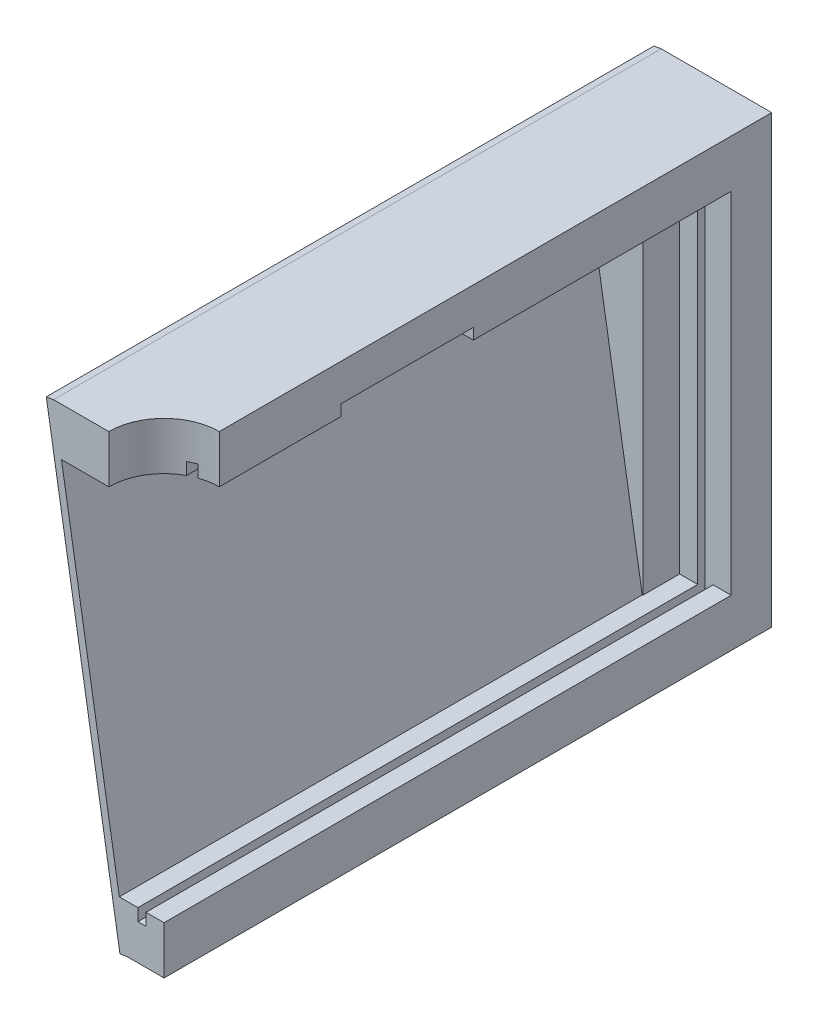
ISO-10303-21;
HEADER;
FILE_DESCRIPTION(('STEP AP214'),'2;1');
FILE_NAME('part.step','',(''),(''),'','','');
FILE_SCHEMA(('AUTOMOTIVE_DESIGN { 1 0 10303 214 1 1 1 1 }'));
ENDSEC;
DATA;
#1=APPLICATION_CONTEXT('core data for automotive mechanical design processes');
#2=APPLICATION_PROTOCOL_DEFINITION('international standard','automotive_design',2000,#1);
#3=PRODUCT_CONTEXT('',#1,'mechanical');
#4=PRODUCT('Part','Part','',(#3));
#5=PRODUCT_RELATED_PRODUCT_CATEGORY('part','',(#4));
#6=PRODUCT_DEFINITION_FORMATION('','',#4);
#7=PRODUCT_DEFINITION_CONTEXT('part definition',#1,'design');
#8=PRODUCT_DEFINITION('design','',#6,#7);
#9=PRODUCT_DEFINITION_SHAPE('','',#8);
#10=(LENGTH_UNIT() NAMED_UNIT(*) SI_UNIT(.MILLI.,.METRE.));
#11=(NAMED_UNIT(*) PLANE_ANGLE_UNIT() SI_UNIT($,.RADIAN.));
#12=(NAMED_UNIT(*) SI_UNIT($,.STERADIAN.) SOLID_ANGLE_UNIT());
#13=UNCERTAINTY_MEASURE_WITH_UNIT(LENGTH_MEASURE(1.E-05),#10,'distance_accuracy_value','');
#14=(GEOMETRIC_REPRESENTATION_CONTEXT(3) GLOBAL_UNCERTAINTY_ASSIGNED_CONTEXT((#13)) GLOBAL_UNIT_ASSIGNED_CONTEXT((#10,
#11,#12)) REPRESENTATION_CONTEXT('',''));
#15=CARTESIAN_POINT('',(0.,0.,0.));
#16=DIRECTION('',(0.,0.,1.));
#17=DIRECTION('',(1.,0.,0.));
#18=AXIS2_PLACEMENT_3D('',#15,#16,#17);
#19=CARTESIAN_POINT('',(40.,104.12857495044,-107.873574899705));
#20=DIRECTION('',(0.,1.,0.));
#21=DIRECTION('',(0.,0.,1.));
#22=AXIS2_PLACEMENT_3D('',#19,#20,#21);
#23=PLANE('',#22);
#24=CARTESIAN_POINT('',(40.,104.12857495044,34.1264251002952));
#25=DIRECTION('',(0.,1.,0.));
#26=DIRECTION('',(0.,0.,1.));
#27=AXIS2_PLACEMENT_3D('',#24,#25,#26);
#28=CIRCLE('',#27,15.);
#29=CARTESIAN_POINT('',(40.,104.12857495044,19.1264251002952));
#30=VERTEX_POINT('',#29);
#31=CARTESIAN_POINT('',(35.1,104.12857495044,19.9493308987318));
#32=VERTEX_POINT('',#31);
#33=EDGE_CURVE('E283',#30,#32,#28,.T.);
#34=ORIENTED_EDGE('',*,*,#33,.T.);
#35=DIRECTION('',(0.,0.,-1.));
#36=VECTOR('',#35,1.);
#37=CARTESIAN_POINT('',(35.1,104.12857495044,-107.873574899705));
#38=LINE('',#37,#36);
#39=CARTESIAN_POINT('',(35.1,104.12857495044,-13.8735748997049));
#40=VERTEX_POINT('',#39);
#41=EDGE_CURVE('E48',#32,#40,#38,.T.);
#42=ORIENTED_EDGE('',*,*,#41,.T.);
#43=DIRECTION('',(1.,0.,0.));
#44=VECTOR('',#43,1.);
#45=CARTESIAN_POINT('',(34.,104.12857495044,-13.8735748997049));
#46=LINE('',#45,#44);
#47=CARTESIAN_POINT('',(40.,104.12857495044,-13.8735748997049));
#48=VERTEX_POINT('',#47);
#49=EDGE_CURVE('E296',#40,#48,#46,.T.);
#50=ORIENTED_EDGE('',*,*,#49,.T.);
#51=DIRECTION('',(0.,0.,-1.));
#52=VECTOR('',#51,1.);
#53=CARTESIAN_POINT('',(40.,104.12857495044,-107.873574899705));
#54=LINE('',#53,#52);
#55=EDGE_CURVE('E364',#30,#48,#54,.T.);
#56=ORIENTED_EDGE('',*,*,#55,.F.);
#57=EDGE_LOOP('',(#34,#42,#50,#56));
#58=FACE_BOUND('',#57,.T.);
#59=ADVANCED_FACE('F33',(#58),#23,.F.);
#60=CARTESIAN_POINT('',(40.,104.12857495044,-107.873574899705));
#61=DIRECTION('',(0.,0.,-1.));
#62=DIRECTION('',(0.,1.,0.));
#63=AXIS2_PLACEMENT_3D('',#60,#61,#62);
#64=PLANE('',#63);
#65=DIRECTION('',(0.,-1.,0.));
#66=VECTOR('',#65,1.);
#67=CARTESIAN_POINT('',(28.,104.12857495044,-107.873574899705));
#68=LINE('',#67,#66);
#69=CARTESIAN_POINT('',(28.,104.12857495044,-107.873574899705));
#70=VERTEX_POINT('',#69);
#71=CARTESIAN_POINT('',(28.,9.1285749504402,-107.873574899705));
#72=VERTEX_POINT('',#71);
#73=EDGE_CURVE('E298',#70,#72,#68,.T.);
#74=ORIENTED_EDGE('',*,*,#73,.F.);
#75=DIRECTION('',(-1.,0.,0.));
#76=VECTOR('',#75,1.);
#77=CARTESIAN_POINT('',(40.,104.12857495044,-107.873574899705));
#78=LINE('',#77,#76);
#79=CARTESIAN_POINT('',(12.1487603305785,104.12857495044,-107.873574899705));
#80=VERTEX_POINT('',#79);
#81=EDGE_CURVE('E384',#70,#80,#78,.T.);
#82=ORIENTED_EDGE('',*,*,#81,.T.);
#83=DIRECTION('',(0.163076596924055,-0.986613411390535,0.));
#84=VECTOR('',#83,1.);
#85=CARTESIAN_POINT('',(12.8894355428495,99.6474899162005,-107.873574899705));
#86=LINE('',#85,#84);
#87=CARTESIAN_POINT('',(27.8512396694215,9.1285749504402,-107.873574899705));
#88=VERTEX_POINT('',#87);
#89=EDGE_CURVE('E352',#80,#88,#86,.T.);
#90=ORIENTED_EDGE('',*,*,#89,.T.);
#91=DIRECTION('',(-1.,0.,0.));
#92=VECTOR('',#91,1.);
#93=CARTESIAN_POINT('',(40.,9.1285749504402,-107.873574899705));
#94=LINE('',#93,#92);
#95=EDGE_CURVE('E382',#72,#88,#94,.T.);
#96=ORIENTED_EDGE('',*,*,#95,.F.);
#97=EDGE_LOOP('',(#74,#82,#90,#96));
#98=FACE_BOUND('',#97,.T.);
#99=ADVANCED_FACE('F466',(#98),#64,.F.);
#100=CARTESIAN_POINT('',(40.,9.1285749504402,-107.873574899705));
#101=DIRECTION('',(0.,-1.,0.));
#102=DIRECTION('',(0.,0.,-1.));
#103=AXIS2_PLACEMENT_3D('',#100,#101,#102);
#104=PLANE('',#103);
#105=DIRECTION('',(-1.,0.,0.));
#106=VECTOR('',#105,1.);
#107=CARTESIAN_POINT('',(40.,9.12857495044018,34.1264251002951));
#108=LINE('',#107,#106);
#109=CARTESIAN_POINT('',(32.9,9.12857495044021,34.1264251002951));
#110=VERTEX_POINT('',#109);
#111=CARTESIAN_POINT('',(27.8512396694215,9.12857495044018,34.1264251002952));
#112=VERTEX_POINT('',#111);
#113=EDGE_CURVE('E378',#110,#112,#108,.T.);
#114=ORIENTED_EDGE('',*,*,#113,.F.);
#115=DIRECTION('',(0.,0.,-1.));
#116=VECTOR('',#115,1.);
#117=CARTESIAN_POINT('',(32.9,9.1285749504402,-107.873574899705));
#118=LINE('',#117,#116);
#119=CARTESIAN_POINT('',(32.9,9.1285749504402,-117.873574899705));
#120=VERTEX_POINT('',#119);
#121=EDGE_CURVE('E264',#110,#120,#118,.T.);
#122=ORIENTED_EDGE('',*,*,#121,.T.);
#123=DIRECTION('',(1.,0.,0.));
#124=VECTOR('',#123,1.);
#125=CARTESIAN_POINT('',(28.,9.1285749504402,-117.873574899705));
#126=LINE('',#125,#124);
#127=CARTESIAN_POINT('',(28.,9.1285749504402,-117.873574899705));
#128=VERTEX_POINT('',#127);
#129=EDGE_CURVE('E314',#128,#120,#126,.T.);
#130=ORIENTED_EDGE('',*,*,#129,.F.);
#131=DIRECTION('',(0.,0.,-1.));
#132=VECTOR('',#131,1.);
#133=CARTESIAN_POINT('',(28.,9.1285749504402,-107.873574899705));
#134=LINE('',#133,#132);
#135=EDGE_CURVE('E306',#72,#128,#134,.T.);
#136=ORIENTED_EDGE('',*,*,#135,.F.);
#137=ORIENTED_EDGE('',*,*,#95,.T.);
#138=DIRECTION('',(0.,0.,1.));
#139=VECTOR('',#138,1.);
#140=CARTESIAN_POINT('',(27.8512396694215,9.1285749504402,-107.873574899705));
#141=LINE('',#140,#139);
#142=EDGE_CURVE('E347',#88,#112,#141,.T.);
#143=ORIENTED_EDGE('',*,*,#142,.T.);
#144=EDGE_LOOP('',(#114,#122,#130,#136,#137,#143));
#145=FACE_BOUND('',#144,.T.);
#146=ADVANCED_FACE('F471',(#145),#104,.F.);
#147=DIRECTION('',(1.,0.,0.));
#148=VECTOR('',#147,1.);
#149=CARTESIAN_POINT('',(28.,104.12857495044,-117.873574899705));
#150=LINE('',#149,#148);
#151=CARTESIAN_POINT('',(28.,104.12857495044,-117.873574899705));
#152=VERTEX_POINT('',#151);
#153=CARTESIAN_POINT('',(32.9,104.12857495044,-117.873574899705));
#154=VERTEX_POINT('',#153);
#155=EDGE_CURVE('E215',#152,#154,#150,.T.);
#156=ORIENTED_EDGE('',*,*,#155,.T.);
#157=DIRECTION('',(0.,0.,1.));
#158=VECTOR('',#157,1.);
#159=CARTESIAN_POINT('',(32.9,104.12857495044,-107.873574899705));
#160=LINE('',#159,#158);
#161=CARTESIAN_POINT('',(32.9,104.12857495044,20.9131741755605));
#162=VERTEX_POINT('',#161);
#163=EDGE_CURVE('E258',#154,#162,#160,.T.);
#164=ORIENTED_EDGE('',*,*,#163,.T.);
#165=CARTESIAN_POINT('',(40.,104.12857495044,34.1264251002952));
#166=DIRECTION('',(0.,1.,0.));
#167=DIRECTION('',(0.,0.,1.));
#168=AXIS2_PLACEMENT_3D('',#165,#166,#167);
#169=CIRCLE('',#168,15.);
#170=CARTESIAN_POINT('',(25.,104.12857495044,34.1264251002952));
#171=VERTEX_POINT('',#170);
#172=EDGE_CURVE('E280',#162,#171,#169,.T.);
#173=ORIENTED_EDGE('',*,*,#172,.T.);
#174=DIRECTION('',(-1.,0.,0.));
#175=VECTOR('',#174,1.);
#176=CARTESIAN_POINT('',(40.,104.12857495044,34.1264251002952));
#177=LINE('',#176,#175);
#178=CARTESIAN_POINT('',(12.1487603305785,104.12857495044,34.1264251002952));
#179=VERTEX_POINT('',#178);
#180=EDGE_CURVE('E386',#171,#179,#177,.T.);
#181=ORIENTED_EDGE('',*,*,#180,.T.);
#182=DIRECTION('',(0.,0.,-1.));
#183=VECTOR('',#182,1.);
#184=CARTESIAN_POINT('',(12.1487603305785,104.12857495044,-107.873574899705));
#185=LINE('',#184,#183);
#186=EDGE_CURVE('E355',#179,#80,#185,.T.);
#187=ORIENTED_EDGE('',*,*,#186,.T.);
#188=ORIENTED_EDGE('',*,*,#81,.F.);
#189=DIRECTION('',(0.,0.,1.));
#190=VECTOR('',#189,1.);
#191=CARTESIAN_POINT('',(28.,104.12857495044,-107.873574899705));
#192=LINE('',#191,#190);
#193=EDGE_CURVE('E312',#152,#70,#192,.T.);
#194=ORIENTED_EDGE('',*,*,#193,.F.);
#195=EDGE_LOOP('',(#156,#164,#173,#181,#187,#188,#194));
#196=FACE_BOUND('',#195,.T.);
#197=ADVANCED_FACE('F447',(#196),#23,.F.);
#198=CARTESIAN_POINT('',(40.,117.12857495044,-130.873574899705));
#199=DIRECTION('',(0.,0.,1.));
#200=DIRECTION('',(1.,0.,0.));
#201=AXIS2_PLACEMENT_3D('',#198,#199,#200);
#202=PLANE('',#201);
#203=DIRECTION('',(-1.,0.,0.));
#204=VECTOR('',#203,1.);
#205=CARTESIAN_POINT('',(40.,-3.8714250495598,-130.873574899705));
#206=LINE('',#205,#204);
#207=CARTESIAN_POINT('',(40.,-3.8714250495598,-130.873574899705));
#208=VERTEX_POINT('',#207);
#209=CARTESIAN_POINT('',(30.,-3.8714250495598,-130.873574899705));
#210=VERTEX_POINT('',#209);
#211=EDGE_CURVE('E372',#208,#210,#206,.T.);
#212=ORIENTED_EDGE('',*,*,#211,.T.);
#213=DIRECTION('',(0.986613411390535,0.163076596924055,0.));
#214=VECTOR('',#213,1.);
#215=CARTESIAN_POINT('',(28.0267731772189,-4.19757824340791,-130.873574899705));
#216=LINE('',#215,#214);
#217=CARTESIAN_POINT('',(28.0267731772189,-4.19757824340791,-130.873574899705));
#218=VERTEX_POINT('',#217);
#219=EDGE_CURVE('E339',#218,#210,#216,.T.);
#220=ORIENTED_EDGE('',*,*,#219,.F.);
#221=DIRECTION('',(0.163076596924055,-0.986613411390535,0.));
#222=VECTOR('',#221,1.);
#223=CARTESIAN_POINT('',(8.02677317721893,116.802421756592,-130.873574899705));
#224=LINE('',#223,#222);
#225=CARTESIAN_POINT('',(8.02677317721893,116.802421756592,-130.873574899705));
#226=VERTEX_POINT('',#225);
#227=EDGE_CURVE('E325',#226,#218,#224,.T.);
#228=ORIENTED_EDGE('',*,*,#227,.F.);
#229=DIRECTION('',(0.986613411390535,0.163076596924055,0.));
#230=VECTOR('',#229,1.);
#231=CARTESIAN_POINT('',(8.02677317721893,116.802421756592,-130.873574899705));
#232=LINE('',#231,#230);
#233=CARTESIAN_POINT('',(10.,117.12857495044,-130.873574899705));
#234=VERTEX_POINT('',#233);
#235=EDGE_CURVE('E341',#226,#234,#232,.T.);
#236=ORIENTED_EDGE('',*,*,#235,.T.);
#237=DIRECTION('',(-1.,0.,0.));
#238=VECTOR('',#237,1.);
#239=CARTESIAN_POINT('',(40.,117.12857495044,-130.873574899705));
#240=LINE('',#239,#238);
#241=CARTESIAN_POINT('',(40.,117.12857495044,-130.873574899705));
#242=VERTEX_POINT('',#241);
#243=EDGE_CURVE('E390',#242,#234,#240,.T.);
#244=ORIENTED_EDGE('',*,*,#243,.F.);
#245=DIRECTION('',(0.,1.,0.));
#246=VECTOR('',#245,1.);
#247=CARTESIAN_POINT('',(40.,117.12857495044,-130.873574899705));
#248=LINE('',#247,#246);
#249=EDGE_CURVE('E358',#208,#242,#248,.T.);
#250=ORIENTED_EDGE('',*,*,#249,.F.);
#251=EDGE_LOOP('',(#212,#220,#228,#236,#244,#250));
#252=FACE_BOUND('',#251,.T.);
#253=ADVANCED_FACE('F35',(#252),#202,.F.);
#254=CARTESIAN_POINT('',(40.,117.12857495044,-130.873574899705));
#255=DIRECTION('',(0.,-1.,0.));
#256=DIRECTION('',(0.,0.,-1.));
#257=AXIS2_PLACEMENT_3D('',#254,#255,#256);
#258=PLANE('',#257);
#259=DIRECTION('',(-1.,0.,0.));
#260=VECTOR('',#259,1.);
#261=CARTESIAN_POINT('',(40.,117.12857495044,34.1264251002952));
#262=LINE('',#261,#260);
#263=CARTESIAN_POINT('',(25.,117.12857495044,34.1264251002952));
#264=VERTEX_POINT('',#263);
#265=CARTESIAN_POINT('',(10.,117.12857495044,34.1264251002952));
#266=VERTEX_POINT('',#265);
#267=EDGE_CURVE('E388',#264,#266,#262,.T.);
#268=ORIENTED_EDGE('',*,*,#267,.F.);
#269=CARTESIAN_POINT('',(40.,117.12857495044,34.1264251002952));
#270=DIRECTION('',(0.,1.,0.));
#271=DIRECTION('',(0.,0.,1.));
#272=AXIS2_PLACEMENT_3D('',#269,#270,#271);
#273=CIRCLE('',#272,15.);
#274=CARTESIAN_POINT('',(40.,117.12857495044,19.1264251002952));
#275=VERTEX_POINT('',#274);
#276=EDGE_CURVE('E273',#275,#264,#273,.T.);
#277=ORIENTED_EDGE('',*,*,#276,.F.);
#278=DIRECTION('',(0.,0.,1.));
#279=VECTOR('',#278,1.);
#280=CARTESIAN_POINT('',(40.,117.12857495044,-130.873574899705));
#281=LINE('',#280,#279);
#282=EDGE_CURVE('E360',#242,#275,#281,.T.);
#283=ORIENTED_EDGE('',*,*,#282,.F.);
#284=ORIENTED_EDGE('',*,*,#243,.T.);
#285=DIRECTION('',(0.,0.,-1.));
#286=VECTOR('',#285,1.);
#287=CARTESIAN_POINT('',(10.,117.12857495044,97.1264251002952));
#288=LINE('',#287,#286);
#289=EDGE_CURVE('E343',#266,#234,#288,.T.);
#290=ORIENTED_EDGE('',*,*,#289,.F.);
#291=EDGE_LOOP('',(#268,#277,#283,#284,#290));
#292=FACE_BOUND('',#291,.T.);
#293=ADVANCED_FACE('F439',(#292),#258,.F.);
#294=DIRECTION('',(1.,0.,0.));
#295=VECTOR('',#294,1.);
#296=CARTESIAN_POINT('',(34.,104.12857495044,-49.8735748997048));
#297=LINE('',#296,#295);
#298=CARTESIAN_POINT('',(35.1,104.12857495044,-49.8735748997048));
#299=VERTEX_POINT('',#298);
#300=CARTESIAN_POINT('',(40.,104.12857495044,-49.8735748997048));
#301=VERTEX_POINT('',#300);
#302=EDGE_CURVE('E295',#299,#301,#297,.T.);
#303=ORIENTED_EDGE('',*,*,#302,.F.);
#304=DIRECTION('',(0.,0.,-1.));
#305=VECTOR('',#304,1.);
#306=CARTESIAN_POINT('',(35.1,104.12857495044,-107.873574899705));
#307=LINE('',#306,#305);
#308=CARTESIAN_POINT('',(35.1,104.12857495044,-119.873574899705));
#309=VERTEX_POINT('',#308);
#310=EDGE_CURVE('E254',#299,#309,#307,.T.);
#311=ORIENTED_EDGE('',*,*,#310,.T.);
#312=DIRECTION('',(1.,0.,0.));
#313=VECTOR('',#312,1.);
#314=CARTESIAN_POINT('',(35.,104.12857495044,-119.873574899705));
#315=LINE('',#314,#313);
#316=CARTESIAN_POINT('',(40.,104.12857495044,-119.873574899705));
#317=VERTEX_POINT('',#316);
#318=EDGE_CURVE('E271',#309,#317,#315,.T.);
#319=ORIENTED_EDGE('',*,*,#318,.T.);
#320=EDGE_CURVE('E363',#301,#317,#54,.T.);
#321=ORIENTED_EDGE('',*,*,#320,.F.);
#322=EDGE_LOOP('',(#303,#311,#319,#321));
#323=FACE_BOUND('',#322,.T.);
#324=ADVANCED_FACE('F418',(#323),#23,.F.);
#325=DIRECTION('',(1.,0.,0.));
#326=VECTOR('',#325,1.);
#327=CARTESIAN_POINT('',(35.,9.1285749504402,-119.873574899705));
#328=LINE('',#327,#326);
#329=CARTESIAN_POINT('',(35.1,9.1285749504402,-119.873574899705));
#330=VERTEX_POINT('',#329);
#331=CARTESIAN_POINT('',(40.,9.1285749504402,-119.873574899705));
#332=VERTEX_POINT('',#331);
#333=EDGE_CURVE('E270',#330,#332,#328,.T.);
#334=ORIENTED_EDGE('',*,*,#333,.F.);
#335=DIRECTION('',(0.,0.,1.));
#336=VECTOR('',#335,1.);
#337=CARTESIAN_POINT('',(35.1,9.1285749504402,-107.873574899705));
#338=LINE('',#337,#336);
#339=CARTESIAN_POINT('',(35.1,9.12857495044018,34.1264251002951));
#340=VERTEX_POINT('',#339);
#341=EDGE_CURVE('E227',#330,#340,#338,.T.);
#342=ORIENTED_EDGE('',*,*,#341,.T.);
#343=CARTESIAN_POINT('',(40.,9.12857495044018,34.1264251002951));
#344=VERTEX_POINT('',#343);
#345=EDGE_CURVE('E379',#344,#340,#108,.T.);
#346=ORIENTED_EDGE('',*,*,#345,.F.);
#347=DIRECTION('',(0.,0.,1.));
#348=VECTOR('',#347,1.);
#349=CARTESIAN_POINT('',(40.,9.1285749504402,-107.873574899705));
#350=LINE('',#349,#348);
#351=EDGE_CURVE('E367',#332,#344,#350,.T.);
#352=ORIENTED_EDGE('',*,*,#351,.F.);
#353=EDGE_LOOP('',(#334,#342,#346,#352));
#354=FACE_BOUND('',#353,.T.);
#355=ADVANCED_FACE('F425',(#354),#104,.F.);
#356=CARTESIAN_POINT('',(40.,9.12857495044018,34.1264251002951));
#357=DIRECTION('',(0.,0.,-1.));
#358=DIRECTION('',(0.,1.,0.));
#359=AXIS2_PLACEMENT_3D('',#356,#357,#358);
#360=PLANE('',#359);
#361=ORIENTED_EDGE('',*,*,#345,.T.);
#362=DIRECTION('',(0.,1.,0.));
#363=VECTOR('',#362,1.);
#364=CARTESIAN_POINT('',(35.1,5.82857495044018,34.1264251002951));
#365=LINE('',#364,#363);
#366=CARTESIAN_POINT('',(35.1,5.82857495044018,34.1264251002951));
#367=VERTEX_POINT('',#366);
#368=EDGE_CURVE('E233',#367,#340,#365,.T.);
#369=ORIENTED_EDGE('',*,*,#368,.F.);
#370=DIRECTION('',(1.,0.,0.));
#371=VECTOR('',#370,1.);
#372=CARTESIAN_POINT('',(35.,5.82857495044018,34.1264251002951));
#373=LINE('',#372,#371);
#374=CARTESIAN_POINT('',(32.9,5.82857495044018,34.1264251002951));
#375=VERTEX_POINT('',#374);
#376=EDGE_CURVE('E220',#375,#367,#373,.T.);
#377=ORIENTED_EDGE('',*,*,#376,.F.);
#378=DIRECTION('',(0.,-1.,0.));
#379=VECTOR('',#378,1.);
#380=CARTESIAN_POINT('',(32.9,107.42857495044,34.1264251002951));
#381=LINE('',#380,#379);
#382=EDGE_CURVE('E231',#110,#375,#381,.T.);
#383=ORIENTED_EDGE('',*,*,#382,.F.);
#384=ORIENTED_EDGE('',*,*,#113,.T.);
#385=DIRECTION('',(-0.163076596924055,0.986613411390535,0.));
#386=VECTOR('',#385,1.);
#387=CARTESIAN_POINT('',(30.,-3.8714250495598,34.1264251002952));
#388=LINE('',#387,#386);
#389=EDGE_CURVE('E321',#112,#179,#388,.T.);
#390=ORIENTED_EDGE('',*,*,#389,.T.);
#391=ORIENTED_EDGE('',*,*,#180,.F.);
#392=DIRECTION('',(0.,1.,0.));
#393=VECTOR('',#392,1.);
#394=CARTESIAN_POINT('',(25.,90.1285749504402,34.1264251002952));
#395=LINE('',#394,#393);
#396=EDGE_CURVE('E277',#171,#264,#395,.T.);
#397=ORIENTED_EDGE('',*,*,#396,.T.);
#398=ORIENTED_EDGE('',*,*,#267,.T.);
#399=DIRECTION('',(0.986613411390535,0.163076596924055,0.));
#400=VECTOR('',#399,1.);
#401=CARTESIAN_POINT('',(8.02677317721893,116.802421756592,34.1264251002952));
#402=LINE('',#401,#400);
#403=CARTESIAN_POINT('',(8.02677317721893,116.802421756592,34.1264251002952));
#404=VERTEX_POINT('',#403);
#405=EDGE_CURVE('E331',#404,#266,#402,.T.);
#406=ORIENTED_EDGE('',*,*,#405,.F.);
#407=DIRECTION('',(-0.163076596924055,0.986613411390535,0.));
#408=VECTOR('',#407,1.);
#409=CARTESIAN_POINT('',(28.0267731772189,-4.19757824340791,34.1264251002952));
#410=LINE('',#409,#408);
#411=CARTESIAN_POINT('',(28.0267731772189,-4.19757824340791,34.1264251002952));
#412=VERTEX_POINT('',#411);
#413=EDGE_CURVE('E329',#412,#404,#410,.T.);
#414=ORIENTED_EDGE('',*,*,#413,.F.);
#415=DIRECTION('',(0.986613411390535,0.163076596924055,0.));
#416=VECTOR('',#415,1.);
#417=CARTESIAN_POINT('',(28.0267731772189,-4.19757824340791,34.1264251002952));
#418=LINE('',#417,#416);
#419=CARTESIAN_POINT('',(30.,-3.8714250495598,34.1264251002952));
#420=VERTEX_POINT('',#419);
#421=EDGE_CURVE('E336',#412,#420,#418,.T.);
#422=ORIENTED_EDGE('',*,*,#421,.T.);
#423=DIRECTION('',(-1.,0.,0.));
#424=VECTOR('',#423,1.);
#425=CARTESIAN_POINT('',(40.,-3.87142504955982,34.1264251002952));
#426=LINE('',#425,#424);
#427=CARTESIAN_POINT('',(40.,-3.87142504955982,34.1264251002952));
#428=VERTEX_POINT('',#427);
#429=EDGE_CURVE('E375',#428,#420,#426,.T.);
#430=ORIENTED_EDGE('',*,*,#429,.F.);
#431=DIRECTION('',(0.,-1.,0.));
#432=VECTOR('',#431,1.);
#433=CARTESIAN_POINT('',(40.,9.12857495044018,34.1264251002951));
#434=LINE('',#433,#432);
#435=EDGE_CURVE('E369',#344,#428,#434,.T.);
#436=ORIENTED_EDGE('',*,*,#435,.F.);
#437=EDGE_LOOP('',(#361,#369,#377,#383,#384,#390,#391,#397,#398,#406,#414,#422,#430,#436));
#438=FACE_BOUND('',#437,.T.);
#439=ADVANCED_FACE('F427',(#438),#360,.F.);
#440=CARTESIAN_POINT('',(40.,-3.8714250495598,-130.873574899705));
#441=DIRECTION('',(0.,1.,0.));
#442=DIRECTION('',(0.,0.,1.));
#443=AXIS2_PLACEMENT_3D('',#440,#441,#442);
#444=PLANE('',#443);
#445=ORIENTED_EDGE('',*,*,#429,.T.);
#446=DIRECTION('',(0.,0.,-1.));
#447=VECTOR('',#446,1.);
#448=CARTESIAN_POINT('',(30.,-3.8714250495598,97.1264251002952));
#449=LINE('',#448,#447);
#450=EDGE_CURVE('E344',#420,#210,#449,.T.);
#451=ORIENTED_EDGE('',*,*,#450,.T.);
#452=ORIENTED_EDGE('',*,*,#211,.F.);
#453=DIRECTION('',(0.,0.,-1.));
#454=VECTOR('',#453,1.);
#455=CARTESIAN_POINT('',(40.,-3.8714250495598,-130.873574899705));
#456=LINE('',#455,#454);
#457=EDGE_CURVE('E56',#428,#208,#456,.T.);
#458=ORIENTED_EDGE('',*,*,#457,.F.);
#459=EDGE_LOOP('',(#445,#451,#452,#458));
#460=FACE_BOUND('',#459,.T.);
#461=ADVANCED_FACE('F431',(#460),#444,.F.);
#462=CARTESIAN_POINT('',(40.,0.,0.));
#463=DIRECTION('',(-1.,0.,0.));
#464=DIRECTION('',(0.,0.,1.));
#465=AXIS2_PLACEMENT_3D('',#462,#463,#464);
#466=PLANE('',#465);
#467=ORIENTED_EDGE('',*,*,#320,.T.);
#468=DIRECTION('',(0.,1.,0.));
#469=VECTOR('',#468,1.);
#470=CARTESIAN_POINT('',(40.,104.12857495044,-119.873574899705));
#471=LINE('',#470,#469);
#472=EDGE_CURVE('E267',#332,#317,#471,.T.);
#473=ORIENTED_EDGE('',*,*,#472,.F.);
#474=ORIENTED_EDGE('',*,*,#351,.T.);
#475=ORIENTED_EDGE('',*,*,#435,.T.);
#476=ORIENTED_EDGE('',*,*,#457,.T.);
#477=ORIENTED_EDGE('',*,*,#249,.T.);
#478=ORIENTED_EDGE('',*,*,#282,.T.);
#479=DIRECTION('',(0.,1.,0.));
#480=VECTOR('',#479,1.);
#481=CARTESIAN_POINT('',(40.,90.1285749504402,19.1264251002952));
#482=LINE('',#481,#480);
#483=EDGE_CURVE('E276',#30,#275,#482,.T.);
#484=ORIENTED_EDGE('',*,*,#483,.F.);
#485=ORIENTED_EDGE('',*,*,#55,.T.);
#486=DIRECTION('',(0.,-1.,0.));
#487=VECTOR('',#486,1.);
#488=CARTESIAN_POINT('',(40.,104.12857495044,-13.8735748997049));
#489=LINE('',#488,#487);
#490=CARTESIAN_POINT('',(40.,107.12857495044,-13.8735748997049));
#491=VERTEX_POINT('',#490);
#492=EDGE_CURVE('E292',#491,#48,#489,.T.);
#493=ORIENTED_EDGE('',*,*,#492,.F.);
#494=DIRECTION('',(0.,0.,1.));
#495=VECTOR('',#494,1.);
#496=CARTESIAN_POINT('',(40.,107.12857495044,-13.8735748997049));
#497=LINE('',#496,#495);
#498=CARTESIAN_POINT('',(40.,107.12857495044,-49.8735748997048));
#499=VERTEX_POINT('',#498);
#500=EDGE_CURVE('E289',#499,#491,#497,.T.);
#501=ORIENTED_EDGE('',*,*,#500,.F.);
#502=DIRECTION('',(0.,1.,0.));
#503=VECTOR('',#502,1.);
#504=CARTESIAN_POINT('',(40.,107.12857495044,-49.8735748997048));
#505=LINE('',#504,#503);
#506=EDGE_CURVE('E286',#301,#499,#505,.T.);
#507=ORIENTED_EDGE('',*,*,#506,.F.);
#508=EDGE_LOOP('',(#467,#473,#474,#475,#476,#477,#478,#484,#485,#493,#501,#507));
#509=FACE_BOUND('',#508,.T.);
#510=ADVANCED_FACE('F404',(#509),#466,.F.);
#511=CARTESIAN_POINT('',(28.579293356829,4.72385014162463,0.));
#512=DIRECTION('',(-0.986613411390535,-0.163076596924055,0.));
#513=DIRECTION('',(0.163076596924055,-0.986613411390535,0.));
#514=AXIS2_PLACEMENT_3D('',#511,#512,#513);
#515=PLANE('',#514);
#516=ORIENTED_EDGE('',*,*,#389,.F.);
#517=ORIENTED_EDGE('',*,*,#142,.F.);
#518=ORIENTED_EDGE('',*,*,#89,.F.);
#519=ORIENTED_EDGE('',*,*,#186,.F.);
#520=EDGE_LOOP('',(#516,#517,#518,#519));
#521=FACE_BOUND('',#520,.T.);
#522=ADVANCED_FACE('F536',(#521),#515,.F.);
#523=CARTESIAN_POINT('',(8.02677317721893,116.802421756592,34.1264251002952));
#524=DIRECTION('',(0.163076596924055,-0.986613411390535,0.));
#525=DIRECTION('',(0.986613411390535,0.163076596924055,0.));
#526=AXIS2_PLACEMENT_3D('',#523,#524,#525);
#527=PLANE('',#526);
#528=ORIENTED_EDGE('',*,*,#289,.T.);
#529=ORIENTED_EDGE('',*,*,#235,.F.);
#530=DIRECTION('',(0.,0.,-1.));
#531=VECTOR('',#530,1.);
#532=CARTESIAN_POINT('',(8.02677317721893,116.802421756592,34.1264251002952));
#533=LINE('',#532,#531);
#534=EDGE_CURVE('E322',#404,#226,#533,.T.);
#535=ORIENTED_EDGE('',*,*,#534,.F.);
#536=ORIENTED_EDGE('',*,*,#405,.T.);
#537=EDGE_LOOP('',(#528,#529,#535,#536));
#538=FACE_BOUND('',#537,.T.);
#539=ADVANCED_FACE('F651',(#538),#527,.F.);
#540=CARTESIAN_POINT('',(28.0267731772189,-4.19757824340791,-130.873574899705));
#541=DIRECTION('',(-0.163076596924055,0.986613411390535,0.));
#542=DIRECTION('',(-0.986613411390535,-0.163076596924055,0.));
#543=AXIS2_PLACEMENT_3D('',#540,#541,#542);
#544=PLANE('',#543);
#545=ORIENTED_EDGE('',*,*,#450,.F.);
#546=ORIENTED_EDGE('',*,*,#421,.F.);
#547=DIRECTION('',(0.,0.,1.));
#548=VECTOR('',#547,1.);
#549=CARTESIAN_POINT('',(28.0267731772189,-4.19757824340791,-130.873574899705));
#550=LINE('',#549,#548);
#551=EDGE_CURVE('E327',#218,#412,#550,.T.);
#552=ORIENTED_EDGE('',*,*,#551,.F.);
#553=ORIENTED_EDGE('',*,*,#219,.T.);
#554=EDGE_LOOP('',(#545,#546,#552,#553));
#555=FACE_BOUND('',#554,.T.);
#556=ADVANCED_FACE('F648',(#555),#544,.F.);
#557=CARTESIAN_POINT('',(26.606066534048,4.39769694777652,0.));
#558=DIRECTION('',(-0.986613411390535,-0.163076596924055,0.));
#559=DIRECTION('',(0.163076596924055,-0.986613411390535,0.));
#560=AXIS2_PLACEMENT_3D('',#557,#558,#559);
#561=PLANE('',#560);
#562=ORIENTED_EDGE('',*,*,#534,.T.);
#563=ORIENTED_EDGE('',*,*,#227,.T.);
#564=ORIENTED_EDGE('',*,*,#551,.T.);
#565=ORIENTED_EDGE('',*,*,#413,.T.);
#566=EDGE_LOOP('',(#562,#563,#564,#565));
#567=FACE_BOUND('',#566,.T.);
#568=ADVANCED_FACE('F508',(#567),#561,.T.);
#569=CARTESIAN_POINT('',(33.,107.42857495044,-110.873574899705));
#570=DIRECTION('',(0.,1.,0.));
#571=DIRECTION('',(0.,0.,1.));
#572=AXIS2_PLACEMENT_3D('',#569,#570,#571);
#573=PLANE('',#572);
#574=DIRECTION('',(-1.,0.,0.));
#575=VECTOR('',#574,1.);
#576=CARTESIAN_POINT('',(33.,107.42857495044,-119.873574899705));
#577=LINE('',#576,#575);
#578=CARTESIAN_POINT('',(35.1,107.42857495044,-119.873574899705));
#579=VERTEX_POINT('',#578);
#580=CARTESIAN_POINT('',(32.9,107.42857495044,-119.873574899705));
#581=VERTEX_POINT('',#580);
#582=EDGE_CURVE('E214',#579,#581,#577,.T.);
#583=ORIENTED_EDGE('',*,*,#582,.F.);
#584=DIRECTION('',(0.,0.,1.));
#585=VECTOR('',#584,1.);
#586=CARTESIAN_POINT('',(35.1,107.42857495044,-119.873574899705));
#587=LINE('',#586,#585);
#588=CARTESIAN_POINT('',(35.1,107.42857495044,19.9493308987319));
#589=VERTEX_POINT('',#588);
#590=EDGE_CURVE('E223',#579,#589,#587,.T.);
#591=ORIENTED_EDGE('',*,*,#590,.T.);
#592=CARTESIAN_POINT('',(40.,107.42857495044,34.1264251002952));
#593=DIRECTION('',(0.,1.,0.));
#594=DIRECTION('',(0.,0.,1.));
#595=AXIS2_PLACEMENT_3D('',#592,#593,#594);
#596=CIRCLE('',#595,15.);
#597=CARTESIAN_POINT('',(32.9,107.42857495044,20.9131741755605));
#598=VERTEX_POINT('',#597);
#599=EDGE_CURVE('E393',#589,#598,#596,.T.);
#600=ORIENTED_EDGE('',*,*,#599,.T.);
#601=DIRECTION('',(0.,0.,1.));
#602=VECTOR('',#601,1.);
#603=CARTESIAN_POINT('',(32.9,107.42857495044,-119.873574899705));
#604=LINE('',#603,#602);
#605=EDGE_CURVE('E239',#581,#598,#604,.T.);
#606=ORIENTED_EDGE('',*,*,#605,.F.);
#607=EDGE_LOOP('',(#583,#591,#600,#606));
#608=FACE_BOUND('',#607,.T.);
#609=ADVANCED_FACE('F453',(#608),#573,.F.);
#610=CARTESIAN_POINT('',(35.,5.82857495044018,-110.873574899705));
#611=DIRECTION('',(0.,-1.,0.));
#612=DIRECTION('',(0.,0.,-1.));
#613=AXIS2_PLACEMENT_3D('',#610,#611,#612);
#614=PLANE('',#613);
#615=ORIENTED_EDGE('',*,*,#376,.T.);
#616=DIRECTION('',(0.,0.,1.));
#617=VECTOR('',#616,1.);
#618=CARTESIAN_POINT('',(35.1,5.82857495044018,-119.873574899705));
#619=LINE('',#618,#617);
#620=CARTESIAN_POINT('',(35.1,5.82857495044018,-119.873574899705));
#621=VERTEX_POINT('',#620);
#622=EDGE_CURVE('E218',#621,#367,#619,.T.);
#623=ORIENTED_EDGE('',*,*,#622,.F.);
#624=DIRECTION('',(1.,0.,0.));
#625=VECTOR('',#624,1.);
#626=CARTESIAN_POINT('',(35.,5.82857495044018,-119.873574899705));
#627=LINE('',#626,#625);
#628=CARTESIAN_POINT('',(32.9,5.82857495044018,-119.873574899705));
#629=VERTEX_POINT('',#628);
#630=EDGE_CURVE('E202',#629,#621,#627,.T.);
#631=ORIENTED_EDGE('',*,*,#630,.F.);
#632=DIRECTION('',(0.,0.,1.));
#633=VECTOR('',#632,1.);
#634=CARTESIAN_POINT('',(32.9,5.82857495044018,-119.873574899705));
#635=LINE('',#634,#633);
#636=EDGE_CURVE('E237',#629,#375,#635,.T.);
#637=ORIENTED_EDGE('',*,*,#636,.T.);
#638=EDGE_LOOP('',(#615,#623,#631,#637));
#639=FACE_BOUND('',#638,.T.);
#640=ADVANCED_FACE('F219',(#639),#614,.F.);
#641=CARTESIAN_POINT('',(0.,0.,-119.873574899705));
#642=DIRECTION('',(0.,0.,-1.));
#643=DIRECTION('',(-1.,0.,0.));
#644=AXIS2_PLACEMENT_3D('',#641,#642,#643);
#645=PLANE('',#644);
#646=DIRECTION('',(0.,1.,0.));
#647=VECTOR('',#646,1.);
#648=CARTESIAN_POINT('',(35.1,5.82857495044018,-119.873574899705));
#649=LINE('',#648,#647);
#650=EDGE_CURVE('E228',#309,#579,#649,.T.);
#651=ORIENTED_EDGE('',*,*,#650,.T.);
#652=ORIENTED_EDGE('',*,*,#582,.T.);
#653=DIRECTION('',(0.,-1.,0.));
#654=VECTOR('',#653,1.);
#655=CARTESIAN_POINT('',(32.9,107.42857495044,-119.873574899705));
#656=LINE('',#655,#654);
#657=EDGE_CURVE('E210',#581,#629,#656,.T.);
#658=ORIENTED_EDGE('',*,*,#657,.T.);
#659=ORIENTED_EDGE('',*,*,#630,.T.);
#660=EDGE_CURVE('E207',#621,#330,#649,.T.);
#661=ORIENTED_EDGE('',*,*,#660,.T.);
#662=ORIENTED_EDGE('',*,*,#333,.T.);
#663=ORIENTED_EDGE('',*,*,#472,.T.);
#664=ORIENTED_EDGE('',*,*,#318,.F.);
#665=EDGE_LOOP('',(#651,#652,#658,#659,#661,#662,#663,#664));
#666=FACE_BOUND('',#665,.T.);
#667=ADVANCED_FACE('F205',(#666),#645,.F.);
#668=CARTESIAN_POINT('',(28.,9.1285749504402,-117.873574899705));
#669=DIRECTION('',(0.,0.,-1.));
#670=DIRECTION('',(-1.,0.,0.));
#671=AXIS2_PLACEMENT_3D('',#668,#669,#670);
#672=PLANE('',#671);
#673=ORIENTED_EDGE('',*,*,#129,.T.);
#674=DIRECTION('',(0.,1.,0.));
#675=VECTOR('',#674,1.);
#676=CARTESIAN_POINT('',(32.9,9.1285749504402,-117.873574899705));
#677=LINE('',#676,#675);
#678=EDGE_CURVE('E261',#120,#154,#677,.T.);
#679=ORIENTED_EDGE('',*,*,#678,.T.);
#680=ORIENTED_EDGE('',*,*,#155,.F.);
#681=DIRECTION('',(0.,1.,0.));
#682=VECTOR('',#681,1.);
#683=CARTESIAN_POINT('',(28.,9.1285749504402,-117.873574899705));
#684=LINE('',#683,#682);
#685=EDGE_CURVE('E309',#128,#152,#684,.T.);
#686=ORIENTED_EDGE('',*,*,#685,.F.);
#687=EDGE_LOOP('',(#673,#679,#680,#686));
#688=FACE_BOUND('',#687,.T.);
#689=ADVANCED_FACE('F517',(#688),#672,.F.);
#690=CARTESIAN_POINT('',(28.,0.,0.));
#691=DIRECTION('',(1.,0.,0.));
#692=DIRECTION('',(0.,0.,-1.));
#693=AXIS2_PLACEMENT_3D('',#690,#691,#692);
#694=PLANE('',#693);
#695=ORIENTED_EDGE('',*,*,#73,.T.);
#696=ORIENTED_EDGE('',*,*,#135,.T.);
#697=ORIENTED_EDGE('',*,*,#685,.T.);
#698=ORIENTED_EDGE('',*,*,#193,.T.);
#699=EDGE_LOOP('',(#695,#696,#697,#698));
#700=FACE_BOUND('',#699,.T.);
#701=ADVANCED_FACE('F513',(#700),#694,.T.);
#702=CARTESIAN_POINT('',(34.,104.12857495044,-13.8735748997049));
#703=DIRECTION('',(0.,0.,1.));
#704=DIRECTION('',(1.,0.,0.));
#705=AXIS2_PLACEMENT_3D('',#702,#703,#704);
#706=PLANE('',#705);
#707=ORIENTED_EDGE('',*,*,#49,.F.);
#708=DIRECTION('',(0.,1.,0.));
#709=VECTOR('',#708,1.);
#710=CARTESIAN_POINT('',(35.1,104.12857495044,-13.8735748997049));
#711=LINE('',#710,#709);
#712=CARTESIAN_POINT('',(35.1,107.12857495044,-13.8735748997049));
#713=VERTEX_POINT('',#712);
#714=EDGE_CURVE('E245',#40,#713,#711,.T.);
#715=ORIENTED_EDGE('',*,*,#714,.T.);
#716=DIRECTION('',(1.,0.,0.));
#717=VECTOR('',#716,1.);
#718=CARTESIAN_POINT('',(34.,107.12857495044,-13.8735748997049));
#719=LINE('',#718,#717);
#720=EDGE_CURVE('E299',#713,#491,#719,.T.);
#721=ORIENTED_EDGE('',*,*,#720,.T.);
#722=ORIENTED_EDGE('',*,*,#492,.T.);
#723=EDGE_LOOP('',(#707,#715,#721,#722));
#724=FACE_BOUND('',#723,.T.);
#725=ADVANCED_FACE('F407',(#724),#706,.F.);
#726=CARTESIAN_POINT('',(34.,107.12857495044,-13.8735748997049));
#727=DIRECTION('',(0.,1.,0.));
#728=DIRECTION('',(0.,0.,1.));
#729=AXIS2_PLACEMENT_3D('',#726,#727,#728);
#730=PLANE('',#729);
#731=ORIENTED_EDGE('',*,*,#720,.F.);
#732=DIRECTION('',(0.,0.,-1.));
#733=VECTOR('',#732,1.);
#734=CARTESIAN_POINT('',(35.1,107.12857495044,-13.8735748997049));
#735=LINE('',#734,#733);
#736=CARTESIAN_POINT('',(35.1,107.12857495044,-49.8735748997048));
#737=VERTEX_POINT('',#736);
#738=EDGE_CURVE('E248',#713,#737,#735,.T.);
#739=ORIENTED_EDGE('',*,*,#738,.T.);
#740=DIRECTION('',(1.,0.,0.));
#741=VECTOR('',#740,1.);
#742=CARTESIAN_POINT('',(34.,107.12857495044,-49.8735748997048));
#743=LINE('',#742,#741);
#744=EDGE_CURVE('E301',#737,#499,#743,.T.);
#745=ORIENTED_EDGE('',*,*,#744,.T.);
#746=ORIENTED_EDGE('',*,*,#500,.T.);
#747=EDGE_LOOP('',(#731,#739,#745,#746));
#748=FACE_BOUND('',#747,.T.);
#749=ADVANCED_FACE('F410',(#748),#730,.F.);
#750=CARTESIAN_POINT('',(34.,107.12857495044,-49.8735748997048));
#751=DIRECTION('',(0.,0.,-1.));
#752=DIRECTION('',(0.,1.,0.));
#753=AXIS2_PLACEMENT_3D('',#750,#751,#752);
#754=PLANE('',#753);
#755=ORIENTED_EDGE('',*,*,#744,.F.);
#756=DIRECTION('',(0.,-1.,0.));
#757=VECTOR('',#756,1.);
#758=CARTESIAN_POINT('',(35.1,107.12857495044,-49.8735748997048));
#759=LINE('',#758,#757);
#760=EDGE_CURVE('E251',#737,#299,#759,.T.);
#761=ORIENTED_EDGE('',*,*,#760,.T.);
#762=ORIENTED_EDGE('',*,*,#302,.T.);
#763=ORIENTED_EDGE('',*,*,#506,.T.);
#764=EDGE_LOOP('',(#755,#761,#762,#763));
#765=FACE_BOUND('',#764,.T.);
#766=ADVANCED_FACE('F455',(#765),#754,.F.);
#767=CARTESIAN_POINT('',(40.,90.1285749504402,34.1264251002952));
#768=DIRECTION('',(0.,1.,0.));
#769=DIRECTION('',(0.,0.,1.));
#770=AXIS2_PLACEMENT_3D('',#767,#768,#769);
#771=CYLINDRICAL_SURFACE('',#770,15.);
#772=ORIENTED_EDGE('',*,*,#172,.F.);
#773=DIRECTION('',(0.,1.,0.));
#774=VECTOR('',#773,1.);
#775=CARTESIAN_POINT('',(32.9,90.1285749504402,20.9131741755605));
#776=LINE('',#775,#774);
#777=EDGE_CURVE('E11',#162,#598,#776,.T.);
#778=ORIENTED_EDGE('',*,*,#777,.T.);
#779=ORIENTED_EDGE('',*,*,#599,.F.);
#780=DIRECTION('',(0.,1.,0.));
#781=VECTOR('',#780,1.);
#782=CARTESIAN_POINT('',(35.1,90.1285749504402,19.9493308987318));
#783=LINE('',#782,#781);
#784=EDGE_CURVE('E41',#589,#32,#783,.F.);
#785=ORIENTED_EDGE('',*,*,#784,.T.);
#786=ORIENTED_EDGE('',*,*,#33,.F.);
#787=ORIENTED_EDGE('',*,*,#483,.T.);
#788=ORIENTED_EDGE('',*,*,#276,.T.);
#789=ORIENTED_EDGE('',*,*,#396,.F.);
#790=EDGE_LOOP('',(#772,#778,#779,#785,#786,#787,#788,#789));
#791=FACE_BOUND('',#790,.T.);
#792=ADVANCED_FACE('F396',(#791),#771,.F.);
#793=CARTESIAN_POINT('',(35.1,5.82857495044018,-119.873574899705));
#794=DIRECTION('',(1.,0.,0.));
#795=DIRECTION('',(0.,1.,0.));
#796=AXIS2_PLACEMENT_3D('',#793,#794,#795);
#797=PLANE('',#796);
#798=ORIENTED_EDGE('',*,*,#760,.F.);
#799=ORIENTED_EDGE('',*,*,#738,.F.);
#800=ORIENTED_EDGE('',*,*,#714,.F.);
#801=ORIENTED_EDGE('',*,*,#41,.F.);
#802=ORIENTED_EDGE('',*,*,#784,.F.);
#803=ORIENTED_EDGE('',*,*,#590,.F.);
#804=ORIENTED_EDGE('',*,*,#650,.F.);
#805=ORIENTED_EDGE('',*,*,#310,.F.);
#806=EDGE_LOOP('',(#798,#799,#800,#801,#802,#803,#804,#805));
#807=FACE_BOUND('',#806,.T.);
#808=ADVANCED_FACE('F454',(#807),#797,.F.);
#809=CARTESIAN_POINT('',(32.9,107.42857495044,-119.873574899705));
#810=DIRECTION('',(-1.,0.,0.));
#811=DIRECTION('',(0.,-1.,0.));
#812=AXIS2_PLACEMENT_3D('',#809,#810,#811);
#813=PLANE('',#812);
#814=ORIENTED_EDGE('',*,*,#382,.T.);
#815=ORIENTED_EDGE('',*,*,#636,.F.);
#816=ORIENTED_EDGE('',*,*,#657,.F.);
#817=ORIENTED_EDGE('',*,*,#605,.T.);
#818=ORIENTED_EDGE('',*,*,#777,.F.);
#819=ORIENTED_EDGE('',*,*,#163,.F.);
#820=ORIENTED_EDGE('',*,*,#678,.F.);
#821=ORIENTED_EDGE('',*,*,#121,.F.);
#822=EDGE_LOOP('',(#814,#815,#816,#817,#818,#819,#820,#821));
#823=FACE_BOUND('',#822,.T.);
#824=ADVANCED_FACE('F450',(#823),#813,.F.);
#825=ORIENTED_EDGE('',*,*,#660,.F.);
#826=ORIENTED_EDGE('',*,*,#622,.T.);
#827=ORIENTED_EDGE('',*,*,#368,.T.);
#828=ORIENTED_EDGE('',*,*,#341,.F.);
#829=EDGE_LOOP('',(#825,#826,#827,#828));
#830=FACE_BOUND('',#829,.T.);
#831=ADVANCED_FACE('F225',(#830),#797,.F.);
#832=CLOSED_SHELL('',(#59,#99,#146,#197,#253,#293,#324,#355,#439,#461,#510,#522,#539,#556,#568,
#609,#640,#667,#689,#701,#725,#749,#766,#792,#808,#824,#831));
#833=MANIFOLD_SOLID_BREP('B2',#832);
#834=ADVANCED_BREP_SHAPE_REPRESENTATION('',(#18,#833),#14);
#835=SHAPE_DEFINITION_REPRESENTATION(#9,#834);
ENDSEC;
END-ISO-10303-21;
